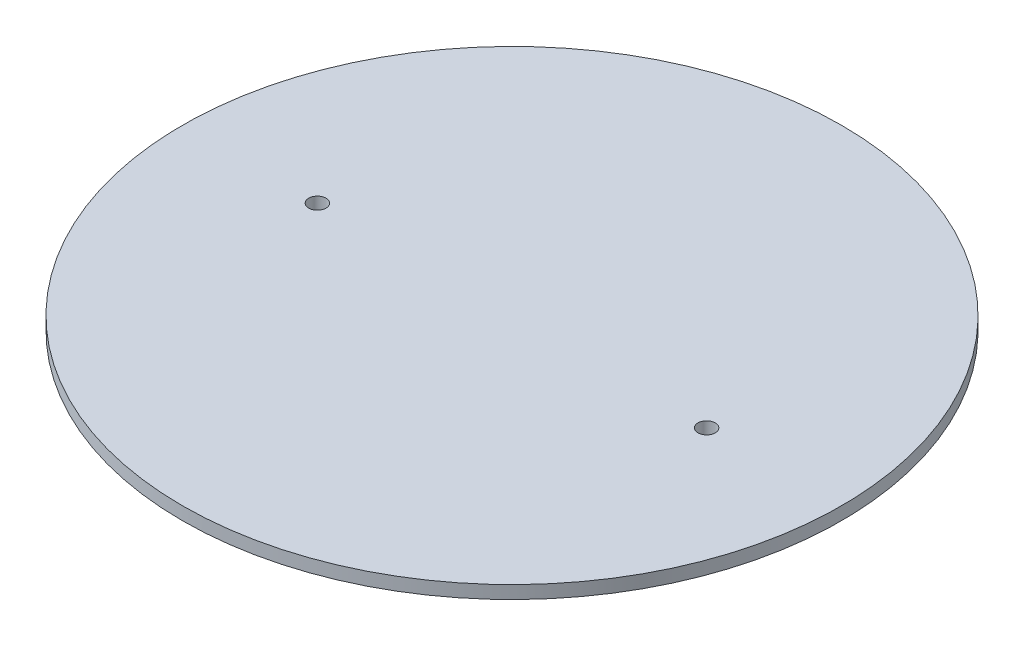
ISO-10303-21;
HEADER;
FILE_DESCRIPTION(('STEP AP214'),'2;1');
FILE_NAME('part.step','',(''),(''),'','','');
FILE_SCHEMA(('AUTOMOTIVE_DESIGN { 1 0 10303 214 1 1 1 1 }'));
ENDSEC;
DATA;
#1=APPLICATION_CONTEXT('core data for automotive mechanical design processes');
#2=APPLICATION_PROTOCOL_DEFINITION('international standard','automotive_design',2000,#1);
#3=PRODUCT_CONTEXT('',#1,'mechanical');
#4=PRODUCT('Part','Part','',(#3));
#5=PRODUCT_RELATED_PRODUCT_CATEGORY('part','',(#4));
#6=PRODUCT_DEFINITION_FORMATION('','',#4);
#7=PRODUCT_DEFINITION_CONTEXT('part definition',#1,'design');
#8=PRODUCT_DEFINITION('design','',#6,#7);
#9=PRODUCT_DEFINITION_SHAPE('','',#8);
#10=(LENGTH_UNIT() NAMED_UNIT(*) SI_UNIT(.MILLI.,.METRE.));
#11=(NAMED_UNIT(*) PLANE_ANGLE_UNIT() SI_UNIT($,.RADIAN.));
#12=(NAMED_UNIT(*) SI_UNIT($,.STERADIAN.) SOLID_ANGLE_UNIT());
#13=UNCERTAINTY_MEASURE_WITH_UNIT(LENGTH_MEASURE(1.E-05),#10,'distance_accuracy_value','');
#14=(GEOMETRIC_REPRESENTATION_CONTEXT(3) GLOBAL_UNCERTAINTY_ASSIGNED_CONTEXT((#13)) GLOBAL_UNIT_ASSIGNED_CONTEXT((#10,
#11,#12)) REPRESENTATION_CONTEXT('',''));
#15=CARTESIAN_POINT('',(0.,0.,0.));
#16=DIRECTION('',(0.,0.,1.));
#17=DIRECTION('',(1.,0.,0.));
#18=AXIS2_PLACEMENT_3D('',#15,#16,#17);
#19=CARTESIAN_POINT('',(0.,3.,0.));
#20=DIRECTION('',(0.,1.,0.));
#21=DIRECTION('',(0.,0.,1.));
#22=AXIS2_PLACEMENT_3D('',#19,#20,#21);
#23=PLANE('',#22);
#24=CARTESIAN_POINT('',(45.,3.,0.));
#25=DIRECTION('',(0.,1.,0.));
#26=DIRECTION('',(0.,0.,1.));
#27=AXIS2_PLACEMENT_3D('',#24,#25,#26);
#28=CIRCLE('',#27,2.);
#29=CARTESIAN_POINT('',(45.,3.,2.00000000000001));
#30=VERTEX_POINT('',#29);
#31=EDGE_CURVE('E50',#30,#30,#28,.T.);
#32=ORIENTED_EDGE('',*,*,#31,.F.);
#33=EDGE_LOOP('',(#32));
#34=FACE_BOUND('',#33,.T.);
#35=CARTESIAN_POINT('',(0.,3.,0.));
#36=DIRECTION('',(0.,1.,0.));
#37=DIRECTION('',(0.,0.,1.));
#38=AXIS2_PLACEMENT_3D('',#35,#36,#37);
#39=CIRCLE('',#38,76.2);
#40=CARTESIAN_POINT('',(0.,3.,76.2));
#41=VERTEX_POINT('',#40);
#42=EDGE_CURVE('E10',#41,#41,#39,.T.);
#43=ORIENTED_EDGE('',*,*,#42,.T.);
#44=EDGE_LOOP('',(#43));
#45=FACE_BOUND('',#44,.T.);
#46=CARTESIAN_POINT('',(-45.,3.,0.));
#47=DIRECTION('',(0.,1.,0.));
#48=DIRECTION('',(0.,0.,1.));
#49=AXIS2_PLACEMENT_3D('',#46,#47,#48);
#50=CIRCLE('',#49,2.);
#51=CARTESIAN_POINT('',(-45.,3.,2.00000000000002));
#52=VERTEX_POINT('',#51);
#53=EDGE_CURVE('E56',#52,#52,#50,.T.);
#54=ORIENTED_EDGE('',*,*,#53,.F.);
#55=EDGE_LOOP('',(#54));
#56=FACE_BOUND('',#55,.T.);
#57=ADVANCED_FACE('F37',(#34,#45,#56),#23,.T.);
#58=CARTESIAN_POINT('',(0.,0.,0.));
#59=DIRECTION('',(0.,1.,0.));
#60=DIRECTION('',(0.,0.,1.));
#61=AXIS2_PLACEMENT_3D('',#58,#59,#60);
#62=PLANE('',#61);
#63=CARTESIAN_POINT('',(0.,0.,0.));
#64=DIRECTION('',(0.,1.,0.));
#65=DIRECTION('',(0.,0.,1.));
#66=AXIS2_PLACEMENT_3D('',#63,#64,#65);
#67=CIRCLE('',#66,76.2);
#68=CARTESIAN_POINT('',(0.,0.,76.2));
#69=VERTEX_POINT('',#68);
#70=EDGE_CURVE('E41',#69,#69,#67,.T.);
#71=ORIENTED_EDGE('',*,*,#70,.F.);
#72=EDGE_LOOP('',(#71));
#73=FACE_BOUND('',#72,.T.);
#74=CARTESIAN_POINT('',(45.,0.,0.));
#75=DIRECTION('',(0.,1.,0.));
#76=DIRECTION('',(0.,0.,1.));
#77=AXIS2_PLACEMENT_3D('',#74,#75,#76);
#78=CIRCLE('',#77,2.);
#79=CARTESIAN_POINT('',(45.,0.,2.00000000000001));
#80=VERTEX_POINT('',#79);
#81=EDGE_CURVE('E52',#80,#80,#78,.T.);
#82=ORIENTED_EDGE('',*,*,#81,.T.);
#83=EDGE_LOOP('',(#82));
#84=FACE_BOUND('',#83,.T.);
#85=CARTESIAN_POINT('',(-45.,0.,0.));
#86=DIRECTION('',(0.,1.,0.));
#87=DIRECTION('',(0.,0.,1.));
#88=AXIS2_PLACEMENT_3D('',#85,#86,#87);
#89=CIRCLE('',#88,2.);
#90=CARTESIAN_POINT('',(-45.,0.,2.00000000000002));
#91=VERTEX_POINT('',#90);
#92=EDGE_CURVE('E60',#91,#91,#89,.T.);
#93=ORIENTED_EDGE('',*,*,#92,.T.);
#94=EDGE_LOOP('',(#93));
#95=FACE_BOUND('',#94,.T.);
#96=ADVANCED_FACE('F72',(#73,#84,#95),#62,.F.);
#97=CARTESIAN_POINT('',(0.,3.,0.));
#98=DIRECTION('',(0.,-1.,0.));
#99=DIRECTION('',(0.,0.,-1.));
#100=AXIS2_PLACEMENT_3D('',#97,#98,#99);
#101=CYLINDRICAL_SURFACE('',#100,76.2);
#102=ORIENTED_EDGE('',*,*,#42,.F.);
#103=EDGE_LOOP('',(#102));
#104=FACE_BOUND('',#103,.T.);
#105=ORIENTED_EDGE('',*,*,#70,.T.);
#106=EDGE_LOOP('',(#105));
#107=FACE_BOUND('',#106,.T.);
#108=ADVANCED_FACE('F39',(#104,#107),#101,.T.);
#109=CARTESIAN_POINT('',(45.,3.,0.));
#110=DIRECTION('',(0.,-1.,0.));
#111=DIRECTION('',(0.,0.,-1.));
#112=AXIS2_PLACEMENT_3D('',#109,#110,#111);
#113=CYLINDRICAL_SURFACE('',#112,2.);
#114=ORIENTED_EDGE('',*,*,#31,.T.);
#115=EDGE_LOOP('',(#114));
#116=FACE_BOUND('',#115,.T.);
#117=ORIENTED_EDGE('',*,*,#81,.F.);
#118=EDGE_LOOP('',(#117));
#119=FACE_BOUND('',#118,.T.);
#120=ADVANCED_FACE('F81',(#116,#119),#113,.F.);
#121=CARTESIAN_POINT('',(-45.,3.,0.));
#122=DIRECTION('',(0.,-1.,0.));
#123=DIRECTION('',(0.,0.,-1.));
#124=AXIS2_PLACEMENT_3D('',#121,#122,#123);
#125=CYLINDRICAL_SURFACE('',#124,2.);
#126=ORIENTED_EDGE('',*,*,#53,.T.);
#127=EDGE_LOOP('',(#126));
#128=FACE_BOUND('',#127,.T.);
#129=ORIENTED_EDGE('',*,*,#92,.F.);
#130=EDGE_LOOP('',(#129));
#131=FACE_BOUND('',#130,.T.);
#132=ADVANCED_FACE('F68',(#128,#131),#125,.F.);
#133=CLOSED_SHELL('',(#57,#96,#108,#120,#132));
#134=MANIFOLD_SOLID_BREP('B2',#133);
#135=ADVANCED_BREP_SHAPE_REPRESENTATION('',(#18,#134),#14);
#136=SHAPE_DEFINITION_REPRESENTATION(#9,#135);
ENDSEC;
END-ISO-10303-21;
